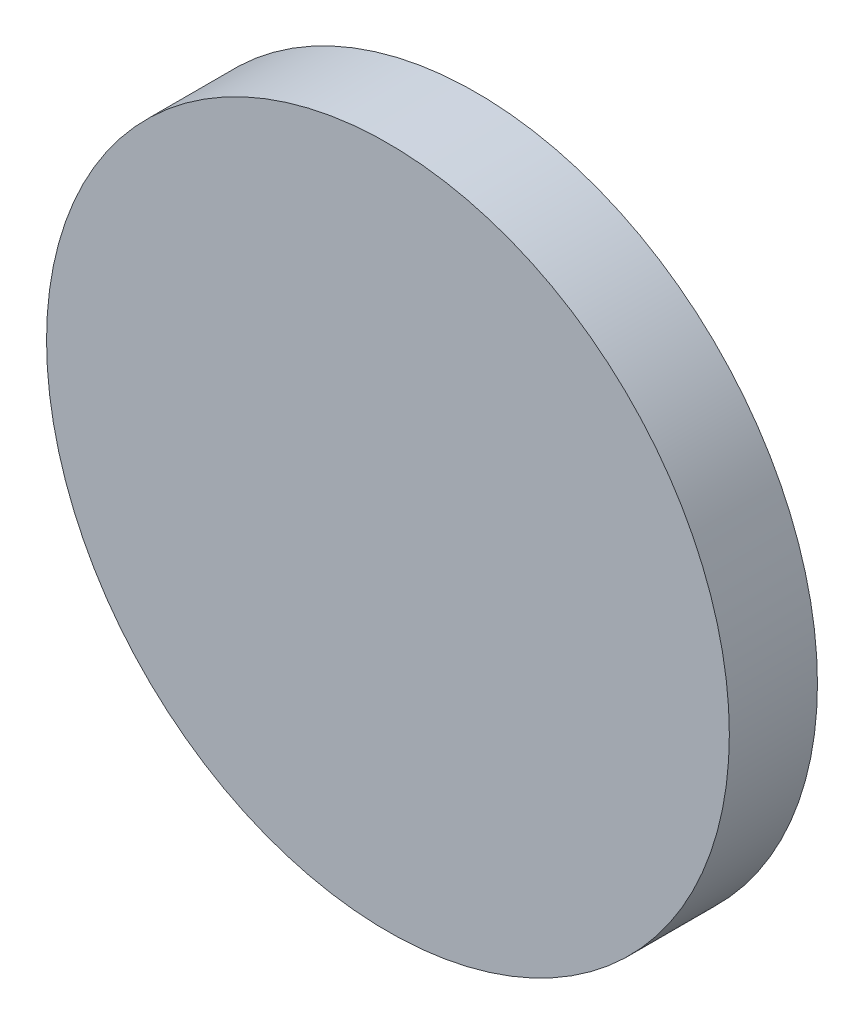
ISO-10303-21;
HEADER;
FILE_DESCRIPTION(('STEP AP214'),'2;1');
FILE_NAME('part.step','',(''),(''),'','','');
FILE_SCHEMA(('AUTOMOTIVE_DESIGN { 1 0 10303 214 1 1 1 1 }'));
ENDSEC;
DATA;
#1=APPLICATION_CONTEXT('core data for automotive mechanical design processes');
#2=APPLICATION_PROTOCOL_DEFINITION('international standard','automotive_design',2000,#1);
#3=PRODUCT_CONTEXT('',#1,'mechanical');
#4=PRODUCT('Part','Part','',(#3));
#5=PRODUCT_RELATED_PRODUCT_CATEGORY('part','',(#4));
#6=PRODUCT_DEFINITION_FORMATION('','',#4);
#7=PRODUCT_DEFINITION_CONTEXT('part definition',#1,'design');
#8=PRODUCT_DEFINITION('design','',#6,#7);
#9=PRODUCT_DEFINITION_SHAPE('','',#8);
#10=(LENGTH_UNIT() NAMED_UNIT(*) SI_UNIT(.MILLI.,.METRE.));
#11=(NAMED_UNIT(*) PLANE_ANGLE_UNIT() SI_UNIT($,.RADIAN.));
#12=(NAMED_UNIT(*) SI_UNIT($,.STERADIAN.) SOLID_ANGLE_UNIT());
#13=UNCERTAINTY_MEASURE_WITH_UNIT(LENGTH_MEASURE(1.E-05),#10,'distance_accuracy_value','');
#14=(GEOMETRIC_REPRESENTATION_CONTEXT(3) GLOBAL_UNCERTAINTY_ASSIGNED_CONTEXT((#13)) GLOBAL_UNIT_ASSIGNED_CONTEXT((#10,
#11,#12)) REPRESENTATION_CONTEXT('',''));
#15=CARTESIAN_POINT('',(0.,0.,0.));
#16=DIRECTION('',(0.,0.,1.));
#17=DIRECTION('',(1.,0.,0.));
#18=AXIS2_PLACEMENT_3D('',#15,#16,#17);
#19=CARTESIAN_POINT('',(0.,0.,10.));
#20=DIRECTION('',(0.,0.,-1.));
#21=DIRECTION('',(-1.,0.,0.));
#22=AXIS2_PLACEMENT_3D('',#19,#20,#21);
#23=CYLINDRICAL_SURFACE('',#22,38.75);
#24=CARTESIAN_POINT('',(0.,0.,10.));
#25=DIRECTION('',(0.,0.,1.));
#26=DIRECTION('',(1.,0.,0.));
#27=AXIS2_PLACEMENT_3D('',#24,#25,#26);
#28=CIRCLE('',#27,38.75);
#29=CARTESIAN_POINT('',(38.75,0.,10.));
#30=VERTEX_POINT('',#29);
#31=EDGE_CURVE('E10',#30,#30,#28,.T.);
#32=ORIENTED_EDGE('',*,*,#31,.F.);
#33=EDGE_LOOP('',(#32));
#34=FACE_BOUND('',#33,.T.);
#35=CARTESIAN_POINT('',(0.,0.,0.));
#36=DIRECTION('',(0.,0.,1.));
#37=DIRECTION('',(1.,0.,0.));
#38=AXIS2_PLACEMENT_3D('',#35,#36,#37);
#39=CIRCLE('',#38,38.75);
#40=CARTESIAN_POINT('',(38.75,0.,0.));
#41=VERTEX_POINT('',#40);
#42=EDGE_CURVE('E40',#41,#41,#39,.T.);
#43=ORIENTED_EDGE('',*,*,#42,.T.);
#44=EDGE_LOOP('',(#43));
#45=FACE_BOUND('',#44,.T.);
#46=ADVANCED_FACE('F37',(#34,#45),#23,.T.);
#47=CARTESIAN_POINT('',(0.,0.,10.));
#48=DIRECTION('',(0.,0.,1.));
#49=DIRECTION('',(1.,0.,0.));
#50=AXIS2_PLACEMENT_3D('',#47,#48,#49);
#51=PLANE('',#50);
#52=ORIENTED_EDGE('',*,*,#31,.T.);
#53=EDGE_LOOP('',(#52));
#54=FACE_BOUND('',#53,.T.);
#55=ADVANCED_FACE('F70',(#54),#51,.T.);
#56=CARTESIAN_POINT('',(0.,0.,0.));
#57=DIRECTION('',(0.,0.,1.));
#58=DIRECTION('',(1.,0.,0.));
#59=AXIS2_PLACEMENT_3D('',#56,#57,#58);
#60=PLANE('',#59);
#61=CARTESIAN_POINT('',(0.,0.,0.));
#62=DIRECTION('',(0.,0.,-1.));
#63=DIRECTION('',(-1.,0.,0.));
#64=AXIS2_PLACEMENT_3D('',#61,#62,#63);
#65=CIRCLE('',#64,37.);
#66=CARTESIAN_POINT('',(-37.,0.,0.));
#67=VERTEX_POINT('',#66);
#68=EDGE_CURVE('E51',#67,#67,#65,.T.);
#69=ORIENTED_EDGE('',*,*,#68,.F.);
#70=EDGE_LOOP('',(#69));
#71=FACE_BOUND('',#70,.T.);
#72=ORIENTED_EDGE('',*,*,#42,.F.);
#73=EDGE_LOOP('',(#72));
#74=FACE_BOUND('',#73,.T.);
#75=ADVANCED_FACE('F64',(#71,#74),#60,.F.);
#76=CARTESIAN_POINT('',(0.,0.,6.99999999999999));
#77=DIRECTION('',(0.,0.,-1.));
#78=DIRECTION('',(-1.,0.,0.));
#79=AXIS2_PLACEMENT_3D('',#76,#77,#78);
#80=CYLINDRICAL_SURFACE('',#79,37.);
#81=CARTESIAN_POINT('',(0.,0.,6.99999999999999));
#82=DIRECTION('',(0.,0.,-1.));
#83=DIRECTION('',(-1.,0.,0.));
#84=AXIS2_PLACEMENT_3D('',#81,#82,#83);
#85=CIRCLE('',#84,37.);
#86=CARTESIAN_POINT('',(-37.,0.,6.99999999999999));
#87=VERTEX_POINT('',#86);
#88=EDGE_CURVE('E49',#87,#87,#85,.T.);
#89=ORIENTED_EDGE('',*,*,#88,.F.);
#90=EDGE_LOOP('',(#89));
#91=FACE_BOUND('',#90,.T.);
#92=ORIENTED_EDGE('',*,*,#68,.T.);
#93=EDGE_LOOP('',(#92));
#94=FACE_BOUND('',#93,.T.);
#95=ADVANCED_FACE('F61',(#91,#94),#80,.F.);
#96=CARTESIAN_POINT('',(0.,0.,6.99999999999999));
#97=DIRECTION('',(0.,0.,-1.));
#98=DIRECTION('',(-1.,0.,0.));
#99=AXIS2_PLACEMENT_3D('',#96,#97,#98);
#100=PLANE('',#99);
#101=ORIENTED_EDGE('',*,*,#88,.T.);
#102=EDGE_LOOP('',(#101));
#103=FACE_BOUND('',#102,.T.);
#104=ADVANCED_FACE('F59',(#103),#100,.T.);
#105=CLOSED_SHELL('',(#46,#55,#75,#95,#104));
#106=MANIFOLD_SOLID_BREP('B2',#105);
#107=ADVANCED_BREP_SHAPE_REPRESENTATION('',(#18,#106),#14);
#108=SHAPE_DEFINITION_REPRESENTATION(#9,#107);
ENDSEC;
END-ISO-10303-21;
